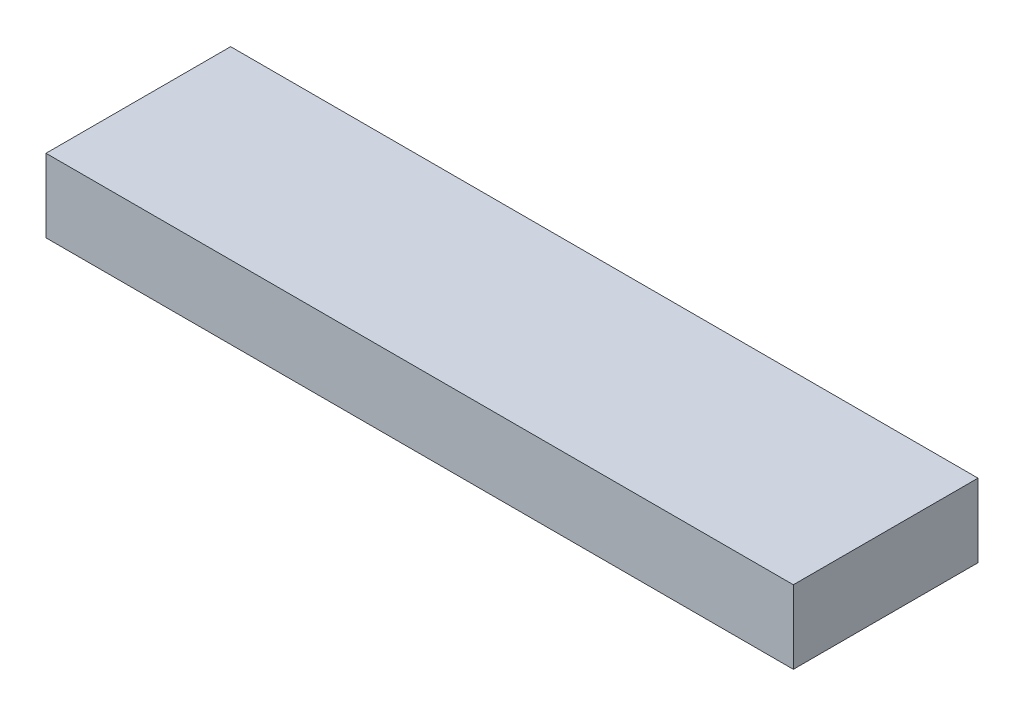
ISO-10303-21;
HEADER;
FILE_DESCRIPTION(('STEP AP214'),'2;1');
FILE_NAME('part.step','',(''),(''),'','','');
FILE_SCHEMA(('AUTOMOTIVE_DESIGN { 1 0 10303 214 1 1 1 1 }'));
ENDSEC;
DATA;
#1=APPLICATION_CONTEXT('core data for automotive mechanical design processes');
#2=APPLICATION_PROTOCOL_DEFINITION('international standard','automotive_design',2000,#1);
#3=PRODUCT_CONTEXT('',#1,'mechanical');
#4=PRODUCT('Part','Part','',(#3));
#5=PRODUCT_RELATED_PRODUCT_CATEGORY('part','',(#4));
#6=PRODUCT_DEFINITION_FORMATION('','',#4);
#7=PRODUCT_DEFINITION_CONTEXT('part definition',#1,'design');
#8=PRODUCT_DEFINITION('design','',#6,#7);
#9=PRODUCT_DEFINITION_SHAPE('','',#8);
#10=(LENGTH_UNIT() NAMED_UNIT(*) SI_UNIT(.MILLI.,.METRE.));
#11=(NAMED_UNIT(*) PLANE_ANGLE_UNIT() SI_UNIT($,.RADIAN.));
#12=(NAMED_UNIT(*) SI_UNIT($,.STERADIAN.) SOLID_ANGLE_UNIT());
#13=UNCERTAINTY_MEASURE_WITH_UNIT(LENGTH_MEASURE(1.E-05),#10,'distance_accuracy_value','');
#14=(GEOMETRIC_REPRESENTATION_CONTEXT(3) GLOBAL_UNCERTAINTY_ASSIGNED_CONTEXT((#13)) GLOBAL_UNIT_ASSIGNED_CONTEXT((#10,
#11,#12)) REPRESENTATION_CONTEXT('',''));
#15=CARTESIAN_POINT('',(0.,0.,0.));
#16=DIRECTION('',(0.,0.,1.));
#17=DIRECTION('',(1.,0.,0.));
#18=AXIS2_PLACEMENT_3D('',#15,#16,#17);
#19=CARTESIAN_POINT('',(64.77,12.7,16.002));
#20=DIRECTION('',(-1.,0.,0.));
#21=DIRECTION('',(0.,0.,1.));
#22=AXIS2_PLACEMENT_3D('',#19,#20,#21);
#23=PLANE('',#22);
#24=DIRECTION('',(0.,0.,-1.));
#25=VECTOR('',#24,1.);
#26=CARTESIAN_POINT('',(64.77,0.,16.002));
#27=LINE('',#26,#25);
#28=CARTESIAN_POINT('',(64.77,0.,16.002));
#29=VERTEX_POINT('',#28);
#30=CARTESIAN_POINT('',(64.77,0.,-16.002));
#31=VERTEX_POINT('',#30);
#32=EDGE_CURVE('E96',#29,#31,#27,.T.);
#33=ORIENTED_EDGE('',*,*,#32,.T.);
#34=DIRECTION('',(0.,-1.,0.));
#35=VECTOR('',#34,1.);
#36=CARTESIAN_POINT('',(64.77,12.7,-16.002));
#37=LINE('',#36,#35);
#38=CARTESIAN_POINT('',(64.77,12.7,-16.002));
#39=VERTEX_POINT('',#38);
#40=EDGE_CURVE('E11',#39,#31,#37,.T.);
#41=ORIENTED_EDGE('',*,*,#40,.F.);
#42=DIRECTION('',(0.,0.,-1.));
#43=VECTOR('',#42,1.);
#44=CARTESIAN_POINT('',(64.77,12.7,16.002));
#45=LINE('',#44,#43);
#46=CARTESIAN_POINT('',(64.77,12.7,16.002));
#47=VERTEX_POINT('',#46);
#48=EDGE_CURVE('E84',#47,#39,#45,.T.);
#49=ORIENTED_EDGE('',*,*,#48,.F.);
#50=DIRECTION('',(0.,-1.,0.));
#51=VECTOR('',#50,1.);
#52=CARTESIAN_POINT('',(64.77,12.7,16.002));
#53=LINE('',#52,#51);
#54=EDGE_CURVE('E92',#47,#29,#53,.T.);
#55=ORIENTED_EDGE('',*,*,#54,.T.);
#56=EDGE_LOOP('',(#33,#41,#49,#55));
#57=FACE_BOUND('',#56,.T.);
#58=ADVANCED_FACE('F33',(#57),#23,.F.);
#59=CARTESIAN_POINT('',(-64.77,12.7,-16.002));
#60=DIRECTION('',(0.,0.,1.));
#61=DIRECTION('',(1.,0.,0.));
#62=AXIS2_PLACEMENT_3D('',#59,#60,#61);
#63=PLANE('',#62);
#64=DIRECTION('',(-1.,0.,0.));
#65=VECTOR('',#64,1.);
#66=CARTESIAN_POINT('',(-64.77,0.,-16.002));
#67=LINE('',#66,#65);
#68=CARTESIAN_POINT('',(-64.77,0.,-16.002));
#69=VERTEX_POINT('',#68);
#70=EDGE_CURVE('E88',#31,#69,#67,.T.);
#71=ORIENTED_EDGE('',*,*,#70,.T.);
#72=DIRECTION('',(0.,-1.,0.));
#73=VECTOR('',#72,1.);
#74=CARTESIAN_POINT('',(-64.77,12.7,-16.002));
#75=LINE('',#74,#73);
#76=CARTESIAN_POINT('',(-64.77,12.7,-16.002));
#77=VERTEX_POINT('',#76);
#78=EDGE_CURVE('E41',#77,#69,#75,.T.);
#79=ORIENTED_EDGE('',*,*,#78,.F.);
#80=DIRECTION('',(-1.,0.,0.));
#81=VECTOR('',#80,1.);
#82=CARTESIAN_POINT('',(-64.77,12.7,-16.002));
#83=LINE('',#82,#81);
#84=EDGE_CURVE('E79',#39,#77,#83,.T.);
#85=ORIENTED_EDGE('',*,*,#84,.F.);
#86=ORIENTED_EDGE('',*,*,#40,.T.);
#87=EDGE_LOOP('',(#71,#79,#85,#86));
#88=FACE_BOUND('',#87,.T.);
#89=ADVANCED_FACE('F87',(#88),#63,.F.);
#90=CARTESIAN_POINT('',(-64.77,12.7,16.002));
#91=DIRECTION('',(1.,0.,0.));
#92=DIRECTION('',(0.,0.,-1.));
#93=AXIS2_PLACEMENT_3D('',#90,#91,#92);
#94=PLANE('',#93);
#95=DIRECTION('',(0.,0.,1.));
#96=VECTOR('',#95,1.);
#97=CARTESIAN_POINT('',(-64.77,0.,16.002));
#98=LINE('',#97,#96);
#99=CARTESIAN_POINT('',(-64.77,0.,16.002));
#100=VERTEX_POINT('',#99);
#101=EDGE_CURVE('E66',#69,#100,#98,.T.);
#102=ORIENTED_EDGE('',*,*,#101,.T.);
#103=DIRECTION('',(0.,-1.,0.));
#104=VECTOR('',#103,1.);
#105=CARTESIAN_POINT('',(-64.77,12.7,16.002));
#106=LINE('',#105,#104);
#107=CARTESIAN_POINT('',(-64.77,12.7,16.002));
#108=VERTEX_POINT('',#107);
#109=EDGE_CURVE('E89',#108,#100,#106,.T.);
#110=ORIENTED_EDGE('',*,*,#109,.F.);
#111=DIRECTION('',(0.,0.,1.));
#112=VECTOR('',#111,1.);
#113=CARTESIAN_POINT('',(-64.77,12.7,16.002));
#114=LINE('',#113,#112);
#115=EDGE_CURVE('E82',#77,#108,#114,.T.);
#116=ORIENTED_EDGE('',*,*,#115,.F.);
#117=ORIENTED_EDGE('',*,*,#78,.T.);
#118=EDGE_LOOP('',(#102,#110,#116,#117));
#119=FACE_BOUND('',#118,.T.);
#120=ADVANCED_FACE('F90',(#119),#94,.F.);
#121=CARTESIAN_POINT('',(-64.77,12.7,16.002));
#122=DIRECTION('',(0.,0.,-1.));
#123=DIRECTION('',(-1.,0.,0.));
#124=AXIS2_PLACEMENT_3D('',#121,#122,#123);
#125=PLANE('',#124);
#126=DIRECTION('',(1.,0.,0.));
#127=VECTOR('',#126,1.);
#128=CARTESIAN_POINT('',(-64.77,0.,16.002));
#129=LINE('',#128,#127);
#130=EDGE_CURVE('E72',#100,#29,#129,.T.);
#131=ORIENTED_EDGE('',*,*,#130,.T.);
#132=ORIENTED_EDGE('',*,*,#54,.F.);
#133=DIRECTION('',(1.,0.,0.));
#134=VECTOR('',#133,1.);
#135=CARTESIAN_POINT('',(-64.77,12.7,16.002));
#136=LINE('',#135,#134);
#137=EDGE_CURVE('E49',#108,#47,#136,.T.);
#138=ORIENTED_EDGE('',*,*,#137,.F.);
#139=ORIENTED_EDGE('',*,*,#109,.T.);
#140=EDGE_LOOP('',(#131,#132,#138,#139));
#141=FACE_BOUND('',#140,.T.);
#142=ADVANCED_FACE('F103',(#141),#125,.F.);
#143=CARTESIAN_POINT('',(0.,12.7,0.));
#144=DIRECTION('',(0.,-1.,0.));
#145=DIRECTION('',(0.,0.,-1.));
#146=AXIS2_PLACEMENT_3D('',#143,#144,#145);
#147=PLANE('',#146);
#148=ORIENTED_EDGE('',*,*,#48,.T.);
#149=ORIENTED_EDGE('',*,*,#84,.T.);
#150=ORIENTED_EDGE('',*,*,#115,.T.);
#151=ORIENTED_EDGE('',*,*,#137,.T.);
#152=EDGE_LOOP('',(#148,#149,#150,#151));
#153=FACE_BOUND('',#152,.T.);
#154=ADVANCED_FACE('F80',(#153),#147,.F.);
#155=CARTESIAN_POINT('',(0.,0.,0.));
#156=DIRECTION('',(0.,-1.,0.));
#157=DIRECTION('',(0.,0.,-1.));
#158=AXIS2_PLACEMENT_3D('',#155,#156,#157);
#159=PLANE('',#158);
#160=ORIENTED_EDGE('',*,*,#32,.F.);
#161=ORIENTED_EDGE('',*,*,#130,.F.);
#162=ORIENTED_EDGE('',*,*,#101,.F.);
#163=ORIENTED_EDGE('',*,*,#70,.F.);
#164=EDGE_LOOP('',(#160,#161,#162,#163));
#165=FACE_BOUND('',#164,.T.);
#166=ADVANCED_FACE('F106',(#165),#159,.T.);
#167=CLOSED_SHELL('',(#58,#89,#120,#142,#154,#166));
#168=MANIFOLD_SOLID_BREP('B2',#167);
#169=ADVANCED_BREP_SHAPE_REPRESENTATION('',(#18,#168),#14);
#170=SHAPE_DEFINITION_REPRESENTATION(#9,#169);
ENDSEC;
END-ISO-10303-21;
